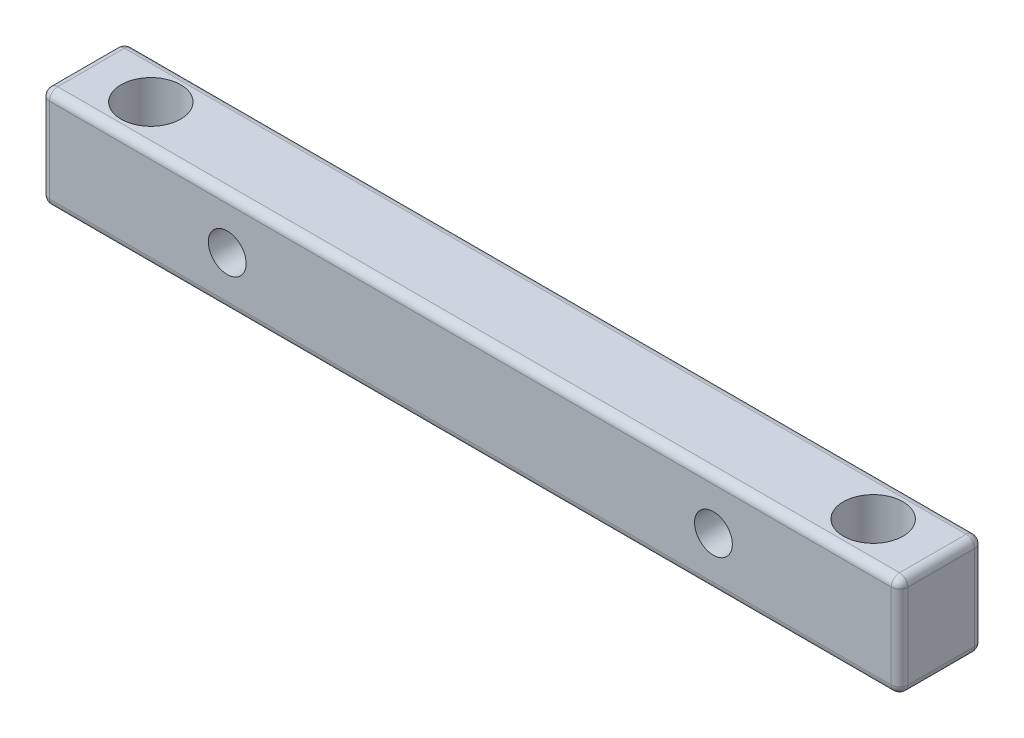
ISO-10303-21;
HEADER;
FILE_DESCRIPTION(('STEP AP214'),'2;1');
FILE_NAME('part.step','',(''),(''),'','','');
FILE_SCHEMA(('AUTOMOTIVE_DESIGN { 1 0 10303 214 1 1 1 1 }'));
ENDSEC;
DATA;
#1=APPLICATION_CONTEXT('core data for automotive mechanical design processes');
#2=APPLICATION_PROTOCOL_DEFINITION('international standard','automotive_design',2000,#1);
#3=PRODUCT_CONTEXT('',#1,'mechanical');
#4=PRODUCT('Part','Part','',(#3));
#5=PRODUCT_RELATED_PRODUCT_CATEGORY('part','',(#4));
#6=PRODUCT_DEFINITION_FORMATION('','',#4);
#7=PRODUCT_DEFINITION_CONTEXT('part definition',#1,'design');
#8=PRODUCT_DEFINITION('design','',#6,#7);
#9=PRODUCT_DEFINITION_SHAPE('','',#8);
#10=(LENGTH_UNIT() NAMED_UNIT(*) SI_UNIT(.MILLI.,.METRE.));
#11=(NAMED_UNIT(*) PLANE_ANGLE_UNIT() SI_UNIT($,.RADIAN.));
#12=(NAMED_UNIT(*) SI_UNIT($,.STERADIAN.) SOLID_ANGLE_UNIT());
#13=UNCERTAINTY_MEASURE_WITH_UNIT(LENGTH_MEASURE(1.E-05),#10,'distance_accuracy_value','');
#14=(GEOMETRIC_REPRESENTATION_CONTEXT(3) GLOBAL_UNCERTAINTY_ASSIGNED_CONTEXT((#13)) GLOBAL_UNIT_ASSIGNED_CONTEXT((#10,
#11,#12)) REPRESENTATION_CONTEXT('',''));
#15=CARTESIAN_POINT('',(0.,0.,0.));
#16=DIRECTION('',(0.,0.,1.));
#17=DIRECTION('',(1.,0.,0.));
#18=AXIS2_PLACEMENT_3D('',#15,#16,#17);
#19=CARTESIAN_POINT('',(0.,9.271,0.));
#20=DIRECTION('',(0.,1.,0.));
#21=DIRECTION('',(0.,0.,1.));
#22=AXIS2_PLACEMENT_3D('',#19,#20,#21);
#23=PLANE('',#22);
#24=DIRECTION('',(1.,0.,0.));
#25=VECTOR('',#24,1.);
#26=CARTESIAN_POINT('',(78.486,9.271,-0.761999999999995));
#27=LINE('',#26,#25);
#28=CARTESIAN_POINT('',(0.762,9.271,-0.762));
#29=VERTEX_POINT('',#28);
#30=CARTESIAN_POINT('',(77.724,9.271,-0.761999999999995));
#31=VERTEX_POINT('',#30);
#32=EDGE_CURVE('E201',#29,#31,#27,.T.);
#33=ORIENTED_EDGE('',*,*,#32,.T.);
#34=DIRECTION('',(0.,0.,-1.));
#35=VECTOR('',#34,1.);
#36=CARTESIAN_POINT('',(77.724,9.271,-7.62));
#37=LINE('',#36,#35);
#38=CARTESIAN_POINT('',(77.724,9.271,-6.858));
#39=VERTEX_POINT('',#38);
#40=EDGE_CURVE('E11',#31,#39,#37,.T.);
#41=ORIENTED_EDGE('',*,*,#40,.T.);
#42=DIRECTION('',(-1.,0.,0.));
#43=VECTOR('',#42,1.);
#44=CARTESIAN_POINT('',(0.,9.271,-6.858));
#45=LINE('',#44,#43);
#46=CARTESIAN_POINT('',(0.762,9.271,-6.858));
#47=VERTEX_POINT('',#46);
#48=EDGE_CURVE('E41',#39,#47,#45,.T.);
#49=ORIENTED_EDGE('',*,*,#48,.T.);
#50=DIRECTION('',(0.,0.,1.));
#51=VECTOR('',#50,1.);
#52=CARTESIAN_POINT('',(0.762,9.271,0.));
#53=LINE('',#52,#51);
#54=EDGE_CURVE('E203',#47,#29,#53,.T.);
#55=ORIENTED_EDGE('',*,*,#54,.T.);
#56=EDGE_LOOP('',(#33,#41,#49,#55));
#57=FACE_BOUND('',#56,.T.);
#58=CARTESIAN_POINT('',(6.223,9.271,-3.81));
#59=DIRECTION('',(0.,1.,0.));
#60=DIRECTION('',(0.,0.,1.));
#61=AXIS2_PLACEMENT_3D('',#58,#59,#60);
#62=CIRCLE('',#61,2.7305);
#63=CARTESIAN_POINT('',(6.223,9.271,-1.0795));
#64=VERTEX_POINT('',#63);
#65=EDGE_CURVE('E158',#64,#64,#62,.T.);
#66=ORIENTED_EDGE('',*,*,#65,.F.);
#67=EDGE_LOOP('',(#66));
#68=FACE_BOUND('',#67,.T.);
#69=CARTESIAN_POINT('',(72.263,9.271,-3.81));
#70=DIRECTION('',(0.,1.,0.));
#71=DIRECTION('',(0.,0.,1.));
#72=AXIS2_PLACEMENT_3D('',#69,#70,#71);
#73=CIRCLE('',#72,2.7305);
#74=CARTESIAN_POINT('',(72.263,9.271,-1.0795));
#75=VERTEX_POINT('',#74);
#76=EDGE_CURVE('E275',#75,#75,#73,.T.);
#77=ORIENTED_EDGE('',*,*,#76,.F.);
#78=EDGE_LOOP('',(#77));
#79=FACE_BOUND('',#78,.T.);
#80=ADVANCED_FACE('F32',(#57,#68,#79),#23,.T.);
#81=CARTESIAN_POINT('',(0.,0.,0.));
#82=DIRECTION('',(0.,1.,0.));
#83=DIRECTION('',(0.,0.,1.));
#84=AXIS2_PLACEMENT_3D('',#81,#82,#83);
#85=PLANE('',#84);
#86=DIRECTION('',(1.,0.,0.));
#87=VECTOR('',#86,1.);
#88=CARTESIAN_POINT('',(0.,0.,-0.762));
#89=LINE('',#88,#87);
#90=CARTESIAN_POINT('',(77.724,0.,-0.761999999999995));
#91=VERTEX_POINT('',#90);
#92=CARTESIAN_POINT('',(0.762,0.,-0.762));
#93=VERTEX_POINT('',#92);
#94=EDGE_CURVE('E185',#91,#93,#89,.F.);
#95=ORIENTED_EDGE('',*,*,#94,.T.);
#96=DIRECTION('',(0.,0.,1.));
#97=VECTOR('',#96,1.);
#98=CARTESIAN_POINT('',(0.762,0.,0.));
#99=LINE('',#98,#97);
#100=CARTESIAN_POINT('',(0.762,0.,-6.858));
#101=VERTEX_POINT('',#100);
#102=EDGE_CURVE('E189',#93,#101,#99,.F.);
#103=ORIENTED_EDGE('',*,*,#102,.T.);
#104=DIRECTION('',(-1.,0.,0.));
#105=VECTOR('',#104,1.);
#106=CARTESIAN_POINT('',(0.,0.,-6.858));
#107=LINE('',#106,#105);
#108=CARTESIAN_POINT('',(77.724,0.,-6.858));
#109=VERTEX_POINT('',#108);
#110=EDGE_CURVE('E187',#101,#109,#107,.F.);
#111=ORIENTED_EDGE('',*,*,#110,.T.);
#112=DIRECTION('',(0.,0.,-1.));
#113=VECTOR('',#112,1.);
#114=CARTESIAN_POINT('',(77.724,0.,-1.41553435639707E-13));
#115=LINE('',#114,#113);
#116=EDGE_CURVE('E183',#109,#91,#115,.F.);
#117=ORIENTED_EDGE('',*,*,#116,.T.);
#118=EDGE_LOOP('',(#95,#103,#111,#117));
#119=FACE_BOUND('',#118,.T.);
#120=CARTESIAN_POINT('',(6.223,0.,-3.81));
#121=DIRECTION('',(0.,1.,0.));
#122=DIRECTION('',(0.,0.,1.));
#123=AXIS2_PLACEMENT_3D('',#120,#121,#122);
#124=CIRCLE('',#123,2.7305);
#125=CARTESIAN_POINT('',(6.223,0.,-1.0795));
#126=VERTEX_POINT('',#125);
#127=EDGE_CURVE('E161',#126,#126,#124,.T.);
#128=ORIENTED_EDGE('',*,*,#127,.T.);
#129=EDGE_LOOP('',(#128));
#130=FACE_BOUND('',#129,.T.);
#131=CARTESIAN_POINT('',(72.263,0.,-3.81));
#132=DIRECTION('',(0.,1.,0.));
#133=DIRECTION('',(0.,0.,1.));
#134=AXIS2_PLACEMENT_3D('',#131,#132,#133);
#135=CIRCLE('',#134,2.7305);
#136=CARTESIAN_POINT('',(72.263,0.,-1.0795));
#137=VERTEX_POINT('',#136);
#138=EDGE_CURVE('E278',#137,#137,#135,.T.);
#139=ORIENTED_EDGE('',*,*,#138,.T.);
#140=EDGE_LOOP('',(#139));
#141=FACE_BOUND('',#140,.T.);
#142=ADVANCED_FACE('F303',(#119,#130,#141),#85,.F.);
#143=CARTESIAN_POINT('',(0.,9.271,-7.62));
#144=DIRECTION('',(1.,0.,0.));
#145=DIRECTION('',(0.,0.,-1.));
#146=AXIS2_PLACEMENT_3D('',#143,#144,#145);
#147=PLANE('',#146);
#148=DIRECTION('',(0.,-1.,0.));
#149=VECTOR('',#148,1.);
#150=CARTESIAN_POINT('',(0.,9.271,-6.858));
#151=LINE('',#150,#149);
#152=CARTESIAN_POINT('',(0.,8.509,-6.858));
#153=VERTEX_POINT('',#152);
#154=CARTESIAN_POINT('',(0.,0.762000000000001,-6.858));
#155=VERTEX_POINT('',#154);
#156=EDGE_CURVE('E132',#153,#155,#151,.T.);
#157=ORIENTED_EDGE('',*,*,#156,.T.);
#158=DIRECTION('',(0.,0.,1.));
#159=VECTOR('',#158,1.);
#160=CARTESIAN_POINT('',(0.,0.762000000000001,-7.62));
#161=LINE('',#160,#159);
#162=CARTESIAN_POINT('',(0.,0.762000000000001,-0.762));
#163=VERTEX_POINT('',#162);
#164=EDGE_CURVE('E128',#155,#163,#161,.T.);
#165=ORIENTED_EDGE('',*,*,#164,.T.);
#166=DIRECTION('',(0.,-1.,0.));
#167=VECTOR('',#166,1.);
#168=CARTESIAN_POINT('',(0.,9.271,-0.762));
#169=LINE('',#168,#167);
#170=CARTESIAN_POINT('',(0.,8.509,-0.762));
#171=VERTEX_POINT('',#170);
#172=EDGE_CURVE('E120',#163,#171,#169,.F.);
#173=ORIENTED_EDGE('',*,*,#172,.T.);
#174=DIRECTION('',(0.,0.,1.));
#175=VECTOR('',#174,1.);
#176=CARTESIAN_POINT('',(0.,8.509,-7.62));
#177=LINE('',#176,#175);
#178=EDGE_CURVE('E125',#171,#153,#177,.F.);
#179=ORIENTED_EDGE('',*,*,#178,.T.);
#180=EDGE_LOOP('',(#157,#165,#173,#179));
#181=FACE_BOUND('',#180,.T.);
#182=ADVANCED_FACE('F123',(#181),#147,.F.);
#183=CARTESIAN_POINT('',(0.,9.271,0.));
#184=DIRECTION('',(0.,0.,-1.));
#185=DIRECTION('',(-1.,0.,0.));
#186=AXIS2_PLACEMENT_3D('',#183,#184,#185);
#187=PLANE('',#186);
#188=DIRECTION('',(1.,0.,0.));
#189=VECTOR('',#188,1.);
#190=CARTESIAN_POINT('',(0.,8.509,0.));
#191=LINE('',#190,#189);
#192=CARTESIAN_POINT('',(77.724,8.509,0.));
#193=VERTEX_POINT('',#192);
#194=CARTESIAN_POINT('',(0.762,8.509,0.));
#195=VERTEX_POINT('',#194);
#196=EDGE_CURVE('E176',#193,#195,#191,.F.);
#197=ORIENTED_EDGE('',*,*,#196,.T.);
#198=DIRECTION('',(0.,-1.,0.));
#199=VECTOR('',#198,1.);
#200=CARTESIAN_POINT('',(0.762,9.271,0.));
#201=LINE('',#200,#199);
#202=CARTESIAN_POINT('',(0.762,0.762000000000001,0.));
#203=VERTEX_POINT('',#202);
#204=EDGE_CURVE('E140',#195,#203,#201,.T.);
#205=ORIENTED_EDGE('',*,*,#204,.T.);
#206=DIRECTION('',(1.,0.,0.));
#207=VECTOR('',#206,1.);
#208=CARTESIAN_POINT('',(0.,0.762000000000001,0.));
#209=LINE('',#208,#207);
#210=CARTESIAN_POINT('',(77.724,0.762000000000001,0.));
#211=VERTEX_POINT('',#210);
#212=EDGE_CURVE('E180',#203,#211,#209,.T.);
#213=ORIENTED_EDGE('',*,*,#212,.T.);
#214=DIRECTION('',(0.,-1.,0.));
#215=VECTOR('',#214,1.);
#216=CARTESIAN_POINT('',(77.724,9.271,0.));
#217=LINE('',#216,#215);
#218=EDGE_CURVE('E178',#211,#193,#217,.F.);
#219=ORIENTED_EDGE('',*,*,#218,.T.);
#220=EDGE_LOOP('',(#197,#205,#213,#219));
#221=FACE_BOUND('',#220,.T.);
#222=CARTESIAN_POINT('',(17.018,4.6355,0.));
#223=DIRECTION('',(0.,0.,1.));
#224=DIRECTION('',(1.,0.,0.));
#225=AXIS2_PLACEMENT_3D('',#222,#223,#224);
#226=CIRCLE('',#225,1.7272);
#227=CARTESIAN_POINT('',(18.7452,4.6355,0.));
#228=VERTEX_POINT('',#227);
#229=EDGE_CURVE('E269',#228,#228,#226,.T.);
#230=ORIENTED_EDGE('',*,*,#229,.F.);
#231=EDGE_LOOP('',(#230));
#232=FACE_BOUND('',#231,.T.);
#233=CARTESIAN_POINT('',(61.468,4.63550000000001,0.));
#234=DIRECTION('',(0.,0.,1.));
#235=DIRECTION('',(1.,0.,0.));
#236=AXIS2_PLACEMENT_3D('',#233,#234,#235);
#237=CIRCLE('',#236,1.7272);
#238=CARTESIAN_POINT('',(63.1952,4.63550000000001,0.));
#239=VERTEX_POINT('',#238);
#240=EDGE_CURVE('E258',#239,#239,#237,.T.);
#241=ORIENTED_EDGE('',*,*,#240,.F.);
#242=EDGE_LOOP('',(#241));
#243=FACE_BOUND('',#242,.T.);
#244=ADVANCED_FACE('F290',(#221,#232,#243),#187,.F.);
#245=CARTESIAN_POINT('',(78.486,9.271,-7.62));
#246=DIRECTION('',(-1.,0.,0.));
#247=DIRECTION('',(0.,0.,1.));
#248=AXIS2_PLACEMENT_3D('',#245,#246,#247);
#249=PLANE('',#248);
#250=DIRECTION('',(0.,-1.,0.));
#251=VECTOR('',#250,1.);
#252=CARTESIAN_POINT('',(78.486,9.271,-0.761999999999996));
#253=LINE('',#252,#251);
#254=CARTESIAN_POINT('',(78.486,8.509,-0.761999999999996));
#255=VERTEX_POINT('',#254);
#256=CARTESIAN_POINT('',(78.486,0.762000000000001,-0.761999999999996));
#257=VERTEX_POINT('',#256);
#258=EDGE_CURVE('E194',#255,#257,#253,.T.);
#259=ORIENTED_EDGE('',*,*,#258,.T.);
#260=DIRECTION('',(0.,0.,-1.));
#261=VECTOR('',#260,1.);
#262=CARTESIAN_POINT('',(78.486,0.762000000000001,-7.62));
#263=LINE('',#262,#261);
#264=CARTESIAN_POINT('',(78.486,0.762000000000001,-6.858));
#265=VERTEX_POINT('',#264);
#266=EDGE_CURVE('E198',#257,#265,#263,.T.);
#267=ORIENTED_EDGE('',*,*,#266,.T.);
#268=DIRECTION('',(0.,-1.,0.));
#269=VECTOR('',#268,1.);
#270=CARTESIAN_POINT('',(78.486,9.271,-6.858));
#271=LINE('',#270,#269);
#272=CARTESIAN_POINT('',(78.486,8.509,-6.858));
#273=VERTEX_POINT('',#272);
#274=EDGE_CURVE('E196',#265,#273,#271,.F.);
#275=ORIENTED_EDGE('',*,*,#274,.T.);
#276=DIRECTION('',(0.,0.,-1.));
#277=VECTOR('',#276,1.);
#278=CARTESIAN_POINT('',(78.486,8.509,0.));
#279=LINE('',#278,#277);
#280=EDGE_CURVE('E192',#273,#255,#279,.F.);
#281=ORIENTED_EDGE('',*,*,#280,.T.);
#282=EDGE_LOOP('',(#259,#267,#275,#281));
#283=FACE_BOUND('',#282,.T.);
#284=ADVANCED_FACE('F293',(#283),#249,.F.);
#285=CARTESIAN_POINT('',(0.,9.271,-7.62));
#286=DIRECTION('',(0.,0.,1.));
#287=DIRECTION('',(1.,0.,0.));
#288=AXIS2_PLACEMENT_3D('',#285,#286,#287);
#289=PLANE('',#288);
#290=DIRECTION('',(-1.,0.,0.));
#291=VECTOR('',#290,1.);
#292=CARTESIAN_POINT('',(0.,0.762000000000001,-7.62));
#293=LINE('',#292,#291);
#294=CARTESIAN_POINT('',(77.724,0.762000000000001,-7.62));
#295=VERTEX_POINT('',#294);
#296=CARTESIAN_POINT('',(0.762,0.762000000000001,-7.62));
#297=VERTEX_POINT('',#296);
#298=EDGE_CURVE('E171',#295,#297,#293,.T.);
#299=ORIENTED_EDGE('',*,*,#298,.T.);
#300=DIRECTION('',(0.,-1.,0.));
#301=VECTOR('',#300,1.);
#302=CARTESIAN_POINT('',(0.762,9.271,-7.62));
#303=LINE('',#302,#301);
#304=CARTESIAN_POINT('',(0.762,8.509,-7.62));
#305=VERTEX_POINT('',#304);
#306=EDGE_CURVE('E173',#297,#305,#303,.F.);
#307=ORIENTED_EDGE('',*,*,#306,.T.);
#308=DIRECTION('',(-1.,0.,0.));
#309=VECTOR('',#308,1.);
#310=CARTESIAN_POINT('',(78.486,8.509,-7.62));
#311=LINE('',#310,#309);
#312=CARTESIAN_POINT('',(77.724,8.509,-7.62));
#313=VERTEX_POINT('',#312);
#314=EDGE_CURVE('E167',#305,#313,#311,.F.);
#315=ORIENTED_EDGE('',*,*,#314,.T.);
#316=DIRECTION('',(0.,-1.,0.));
#317=VECTOR('',#316,1.);
#318=CARTESIAN_POINT('',(77.724,9.271,-7.62));
#319=LINE('',#318,#317);
#320=EDGE_CURVE('E169',#313,#295,#319,.T.);
#321=ORIENTED_EDGE('',*,*,#320,.T.);
#322=EDGE_LOOP('',(#299,#307,#315,#321));
#323=FACE_BOUND('',#322,.T.);
#324=CARTESIAN_POINT('',(17.018,4.6355,-7.62));
#325=DIRECTION('',(0.,0.,1.));
#326=DIRECTION('',(1.,0.,0.));
#327=AXIS2_PLACEMENT_3D('',#324,#325,#326);
#328=CIRCLE('',#327,1.7272);
#329=CARTESIAN_POINT('',(18.7452,4.6355,-7.62));
#330=VERTEX_POINT('',#329);
#331=EDGE_CURVE('E272',#330,#330,#328,.F.);
#332=ORIENTED_EDGE('',*,*,#331,.F.);
#333=EDGE_LOOP('',(#332));
#334=FACE_BOUND('',#333,.T.);
#335=CARTESIAN_POINT('',(61.468,4.63550000000001,-7.62));
#336=DIRECTION('',(0.,0.,1.));
#337=DIRECTION('',(1.,0.,0.));
#338=AXIS2_PLACEMENT_3D('',#335,#336,#337);
#339=CIRCLE('',#338,1.7272);
#340=CARTESIAN_POINT('',(63.1952,4.63550000000001,-7.62));
#341=VERTEX_POINT('',#340);
#342=EDGE_CURVE('E264',#341,#341,#339,.F.);
#343=ORIENTED_EDGE('',*,*,#342,.F.);
#344=EDGE_LOOP('',(#343));
#345=FACE_BOUND('',#344,.T.);
#346=ADVANCED_FACE('F300',(#323,#334,#345),#289,.F.);
#347=CARTESIAN_POINT('',(6.223,9.271,-3.81));
#348=DIRECTION('',(0.,-1.,0.));
#349=DIRECTION('',(0.,0.,-1.));
#350=AXIS2_PLACEMENT_3D('',#347,#348,#349);
#351=CYLINDRICAL_SURFACE('',#350,2.7305);
#352=ORIENTED_EDGE('',*,*,#65,.T.);
#353=EDGE_LOOP('',(#352));
#354=FACE_BOUND('',#353,.T.);
#355=ORIENTED_EDGE('',*,*,#127,.F.);
#356=EDGE_LOOP('',(#355));
#357=FACE_BOUND('',#356,.T.);
#358=ADVANCED_FACE('F314',(#354,#357),#351,.F.);
#359=CARTESIAN_POINT('',(72.263,9.271,-3.81));
#360=DIRECTION('',(0.,-1.,0.));
#361=DIRECTION('',(0.,0.,-1.));
#362=AXIS2_PLACEMENT_3D('',#359,#360,#361);
#363=CYLINDRICAL_SURFACE('',#362,2.7305);
#364=ORIENTED_EDGE('',*,*,#76,.T.);
#365=EDGE_LOOP('',(#364));
#366=FACE_BOUND('',#365,.T.);
#367=ORIENTED_EDGE('',*,*,#138,.F.);
#368=EDGE_LOOP('',(#367));
#369=FACE_BOUND('',#368,.T.);
#370=ADVANCED_FACE('F322',(#366,#369),#363,.F.);
#371=CARTESIAN_POINT('',(61.468,4.63550000000001,-12.5052593298616));
#372=DIRECTION('',(0.,0.,1.));
#373=DIRECTION('',(1.,0.,0.));
#374=AXIS2_PLACEMENT_3D('',#371,#372,#373);
#375=CYLINDRICAL_SURFACE('',#374,1.7272);
#376=CARTESIAN_POINT('',(63.1952,4.63550000000001,-7.62));
#377=CARTESIAN_POINT('',(63.1952,4.63550000000001,-7.540625));
#378=CARTESIAN_POINT('',(63.1952,4.63550000000001,-7.46125));
#379=CARTESIAN_POINT('',(63.1952,4.63550000000001,-7.3025));
#380=CARTESIAN_POINT('',(63.1952,4.63550000000001,-7.223125));
#381=CARTESIAN_POINT('',(63.1952,4.63550000000001,-7.064375));
#382=CARTESIAN_POINT('',(63.1952,4.63550000000001,-6.985));
#383=CARTESIAN_POINT('',(63.1952,4.63550000000001,-6.82625));
#384=CARTESIAN_POINT('',(63.1952,4.63550000000001,-6.746875));
#385=CARTESIAN_POINT('',(63.1952,4.63550000000001,-6.588125));
#386=CARTESIAN_POINT('',(63.1952,4.63550000000001,-6.50875));
#387=CARTESIAN_POINT('',(63.1952,4.63550000000001,-6.35));
#388=CARTESIAN_POINT('',(63.1952,4.63550000000001,-6.270625));
#389=CARTESIAN_POINT('',(63.1952,4.63550000000001,-6.111875));
#390=CARTESIAN_POINT('',(63.1952,4.63550000000001,-6.0325));
#391=CARTESIAN_POINT('',(63.1952,4.63550000000001,-5.87375));
#392=CARTESIAN_POINT('',(63.1952,4.63550000000001,-5.794375));
#393=CARTESIAN_POINT('',(63.1952,4.63550000000001,-5.635625));
#394=CARTESIAN_POINT('',(63.1952,4.63550000000001,-5.55625));
#395=CARTESIAN_POINT('',(63.1952,4.63550000000001,-5.3975));
#396=CARTESIAN_POINT('',(63.1952,4.63550000000001,-5.318125));
#397=CARTESIAN_POINT('',(63.1952,4.63550000000001,-5.159375));
#398=CARTESIAN_POINT('',(63.1952,4.63550000000001,-5.08));
#399=CARTESIAN_POINT('',(63.1952,4.63550000000001,-4.92125));
#400=CARTESIAN_POINT('',(63.1952,4.63550000000001,-4.841875));
#401=CARTESIAN_POINT('',(63.1952,4.63550000000001,-4.683125));
#402=CARTESIAN_POINT('',(63.1952,4.63550000000001,-4.60375));
#403=CARTESIAN_POINT('',(63.1952,4.63550000000001,-4.445));
#404=CARTESIAN_POINT('',(63.1952,4.63550000000001,-4.365625));
#405=CARTESIAN_POINT('',(63.1952,4.63550000000001,-4.206875));
#406=CARTESIAN_POINT('',(63.1952,4.63550000000001,-4.1275));
#407=CARTESIAN_POINT('',(63.1952,4.63550000000001,-3.96875));
#408=CARTESIAN_POINT('',(63.1952,4.63550000000001,-3.889375));
#409=CARTESIAN_POINT('',(63.1952,4.63550000000001,-3.730625));
#410=CARTESIAN_POINT('',(63.1952,4.63550000000001,-3.65125));
#411=CARTESIAN_POINT('',(63.1952,4.63550000000001,-3.4925));
#412=CARTESIAN_POINT('',(63.1952,4.63550000000001,-3.413125));
#413=CARTESIAN_POINT('',(63.1952,4.63550000000001,-3.254375));
#414=CARTESIAN_POINT('',(63.1952,4.63550000000001,-3.175));
#415=CARTESIAN_POINT('',(63.1952,4.63550000000001,-3.01625));
#416=CARTESIAN_POINT('',(63.1952,4.63550000000001,-2.936875));
#417=CARTESIAN_POINT('',(63.1952,4.63550000000001,-2.778125));
#418=CARTESIAN_POINT('',(63.1952,4.63550000000001,-2.69875));
#419=CARTESIAN_POINT('',(63.1952,4.63550000000001,-2.54));
#420=CARTESIAN_POINT('',(63.1952,4.63550000000001,-2.460625));
#421=CARTESIAN_POINT('',(63.1952,4.63550000000001,-2.301875));
#422=CARTESIAN_POINT('',(63.1952,4.63550000000001,-2.2225));
#423=CARTESIAN_POINT('',(63.1952,4.63550000000001,-2.06375));
#424=CARTESIAN_POINT('',(63.1952,4.63550000000001,-1.984375));
#425=CARTESIAN_POINT('',(63.1952,4.63550000000001,-1.825625));
#426=CARTESIAN_POINT('',(63.1952,4.63550000000001,-1.74625));
#427=CARTESIAN_POINT('',(63.1952,4.63550000000001,-1.5875));
#428=CARTESIAN_POINT('',(63.1952,4.63550000000001,-1.508125));
#429=CARTESIAN_POINT('',(63.1952,4.63550000000001,-1.349375));
#430=CARTESIAN_POINT('',(63.1952,4.63550000000001,-1.27));
#431=CARTESIAN_POINT('',(63.1952,4.63550000000001,-1.11125));
#432=CARTESIAN_POINT('',(63.1952,4.63550000000001,-1.031875));
#433=CARTESIAN_POINT('',(63.1952,4.63550000000001,-0.873125000000002));
#434=CARTESIAN_POINT('',(63.1952,4.63550000000001,-0.793750000000002));
#435=CARTESIAN_POINT('',(63.1952,4.63550000000001,-0.635000000000002));
#436=CARTESIAN_POINT('',(63.1952,4.63550000000001,-0.555625000000002));
#437=CARTESIAN_POINT('',(63.1952,4.63550000000001,-0.396875000000002));
#438=CARTESIAN_POINT('',(63.1952,4.63550000000001,-0.317500000000001));
#439=CARTESIAN_POINT('',(63.1952,4.63550000000001,-0.158750000000001));
#440=CARTESIAN_POINT('',(63.1952,4.63550000000001,-0.0793750000000013));
#441=CARTESIAN_POINT('',(63.1952,4.63550000000001,0.));
#442=B_SPLINE_CURVE_WITH_KNOTS('',3,(#376,#377,#378,#379,#380,#381,#382,#383,#384,#385,#386,
#387,#388,#389,#390,#391,#392,#393,#394,#395,#396,#397,#398,#399,#400,#401,#402,#403,#404,#405,
#406,#407,#408,#409,#410,#411,#412,#413,#414,#415,#416,#417,#418,#419,#420,#421,#422,#423,#424,
#425,#426,#427,#428,#429,#430,#431,#432,#433,#434,#435,#436,#437,#438,#439,#440,#441),
.UNSPECIFIED.,.F.,.F.,(4,2,2,2,2,2,2,2,2,2,2,2,2,2,2,2,2,2,2,2,2,2,2,2,2,2,2,2,2,2,2,2,4),(0.,
0.238125,0.47625,0.714375,0.9525,1.190625,1.42875,1.666875,1.905,2.143125,2.38125,2.619375,
2.8575,3.095625,3.33375,3.571875,3.81,4.048125,4.28625,4.524375,4.7625,5.000625,5.23875,
5.476875,5.715,5.953125,6.19125,6.429375,6.6675,6.905625,7.14375,7.381875,7.62),.UNSPECIFIED.);
#443=EDGE_CURVE('BSEAM330',#341,#239,#442,.T.);
#444=ORIENTED_EDGE('',*,*,#342,.T.);
#445=ORIENTED_EDGE('',*,*,#240,.T.);
#446=ORIENTED_EDGE('',*,*,#443,.T.);
#447=ORIENTED_EDGE('',*,*,#443,.F.);
#448=EDGE_LOOP('',(#444,#446,#445,#447));
#449=FACE_BOUND('',#448,.T.);
#450=ADVANCED_FACE('F330',(#449),#375,.F.);
#451=CARTESIAN_POINT('',(17.018,4.6355,-12.5052593298616));
#452=DIRECTION('',(0.,0.,1.));
#453=DIRECTION('',(1.,0.,0.));
#454=AXIS2_PLACEMENT_3D('',#451,#452,#453);
#455=CYLINDRICAL_SURFACE('',#454,1.7272);
#456=CARTESIAN_POINT('',(18.7452,4.6355,-7.62));
#457=CARTESIAN_POINT('',(18.7452,4.6355,-7.540625));
#458=CARTESIAN_POINT('',(18.7452,4.6355,-7.46125));
#459=CARTESIAN_POINT('',(18.7452,4.6355,-7.3025));
#460=CARTESIAN_POINT('',(18.7452,4.6355,-7.223125));
#461=CARTESIAN_POINT('',(18.7452,4.6355,-7.064375));
#462=CARTESIAN_POINT('',(18.7452,4.6355,-6.985));
#463=CARTESIAN_POINT('',(18.7452,4.6355,-6.82625));
#464=CARTESIAN_POINT('',(18.7452,4.6355,-6.746875));
#465=CARTESIAN_POINT('',(18.7452,4.6355,-6.588125));
#466=CARTESIAN_POINT('',(18.7452,4.6355,-6.50875));
#467=CARTESIAN_POINT('',(18.7452,4.6355,-6.35));
#468=CARTESIAN_POINT('',(18.7452,4.6355,-6.270625));
#469=CARTESIAN_POINT('',(18.7452,4.6355,-6.111875));
#470=CARTESIAN_POINT('',(18.7452,4.6355,-6.0325));
#471=CARTESIAN_POINT('',(18.7452,4.6355,-5.87375));
#472=CARTESIAN_POINT('',(18.7452,4.6355,-5.794375));
#473=CARTESIAN_POINT('',(18.7452,4.6355,-5.635625));
#474=CARTESIAN_POINT('',(18.7452,4.6355,-5.55625));
#475=CARTESIAN_POINT('',(18.7452,4.6355,-5.3975));
#476=CARTESIAN_POINT('',(18.7452,4.6355,-5.318125));
#477=CARTESIAN_POINT('',(18.7452,4.6355,-5.159375));
#478=CARTESIAN_POINT('',(18.7452,4.6355,-5.08));
#479=CARTESIAN_POINT('',(18.7452,4.6355,-4.92125));
#480=CARTESIAN_POINT('',(18.7452,4.6355,-4.841875));
#481=CARTESIAN_POINT('',(18.7452,4.6355,-4.683125));
#482=CARTESIAN_POINT('',(18.7452,4.6355,-4.60375));
#483=CARTESIAN_POINT('',(18.7452,4.6355,-4.445));
#484=CARTESIAN_POINT('',(18.7452,4.6355,-4.365625));
#485=CARTESIAN_POINT('',(18.7452,4.6355,-4.206875));
#486=CARTESIAN_POINT('',(18.7452,4.6355,-4.1275));
#487=CARTESIAN_POINT('',(18.7452,4.6355,-3.96875));
#488=CARTESIAN_POINT('',(18.7452,4.6355,-3.889375));
#489=CARTESIAN_POINT('',(18.7452,4.6355,-3.730625));
#490=CARTESIAN_POINT('',(18.7452,4.6355,-3.65125));
#491=CARTESIAN_POINT('',(18.7452,4.6355,-3.4925));
#492=CARTESIAN_POINT('',(18.7452,4.6355,-3.413125));
#493=CARTESIAN_POINT('',(18.7452,4.6355,-3.254375));
#494=CARTESIAN_POINT('',(18.7452,4.6355,-3.175));
#495=CARTESIAN_POINT('',(18.7452,4.6355,-3.01625));
#496=CARTESIAN_POINT('',(18.7452,4.6355,-2.936875));
#497=CARTESIAN_POINT('',(18.7452,4.6355,-2.778125));
#498=CARTESIAN_POINT('',(18.7452,4.6355,-2.69875));
#499=CARTESIAN_POINT('',(18.7452,4.6355,-2.54));
#500=CARTESIAN_POINT('',(18.7452,4.6355,-2.460625));
#501=CARTESIAN_POINT('',(18.7452,4.6355,-2.301875));
#502=CARTESIAN_POINT('',(18.7452,4.6355,-2.2225));
#503=CARTESIAN_POINT('',(18.7452,4.6355,-2.06375));
#504=CARTESIAN_POINT('',(18.7452,4.6355,-1.984375));
#505=CARTESIAN_POINT('',(18.7452,4.6355,-1.825625));
#506=CARTESIAN_POINT('',(18.7452,4.6355,-1.74625));
#507=CARTESIAN_POINT('',(18.7452,4.6355,-1.5875));
#508=CARTESIAN_POINT('',(18.7452,4.6355,-1.508125));
#509=CARTESIAN_POINT('',(18.7452,4.6355,-1.349375));
#510=CARTESIAN_POINT('',(18.7452,4.6355,-1.27));
#511=CARTESIAN_POINT('',(18.7452,4.6355,-1.11125));
#512=CARTESIAN_POINT('',(18.7452,4.6355,-1.031875));
#513=CARTESIAN_POINT('',(18.7452,4.6355,-0.873125000000002));
#514=CARTESIAN_POINT('',(18.7452,4.6355,-0.793750000000002));
#515=CARTESIAN_POINT('',(18.7452,4.6355,-0.635000000000002));
#516=CARTESIAN_POINT('',(18.7452,4.6355,-0.555625000000002));
#517=CARTESIAN_POINT('',(18.7452,4.6355,-0.396875000000002));
#518=CARTESIAN_POINT('',(18.7452,4.6355,-0.317500000000001));
#519=CARTESIAN_POINT('',(18.7452,4.6355,-0.158750000000001));
#520=CARTESIAN_POINT('',(18.7452,4.6355,-0.0793750000000013));
#521=CARTESIAN_POINT('',(18.7452,4.6355,0.));
#522=B_SPLINE_CURVE_WITH_KNOTS('',3,(#456,#457,#458,#459,#460,#461,#462,#463,#464,#465,#466,
#467,#468,#469,#470,#471,#472,#473,#474,#475,#476,#477,#478,#479,#480,#481,#482,#483,#484,#485,
#486,#487,#488,#489,#490,#491,#492,#493,#494,#495,#496,#497,#498,#499,#500,#501,#502,#503,#504,
#505,#506,#507,#508,#509,#510,#511,#512,#513,#514,#515,#516,#517,#518,#519,#520,#521),
.UNSPECIFIED.,.F.,.F.,(4,2,2,2,2,2,2,2,2,2,2,2,2,2,2,2,2,2,2,2,2,2,2,2,2,2,2,2,2,2,2,2,4),(0.,
0.238125,0.47625,0.714375,0.9525,1.190625,1.42875,1.666875,1.905,2.143125,2.38125,2.619375,
2.8575,3.095625,3.33375,3.571875,3.81,4.048125,4.28625,4.524375,4.7625,5.000625,5.23875,
5.476875,5.715,5.953125,6.19125,6.429375,6.6675,6.905625,7.14375,7.381875,7.62),.UNSPECIFIED.);
#523=EDGE_CURVE('BSEAM288',#330,#228,#522,.T.);
#524=ORIENTED_EDGE('',*,*,#331,.T.);
#525=ORIENTED_EDGE('',*,*,#229,.T.);
#526=ORIENTED_EDGE('',*,*,#523,.T.);
#527=ORIENTED_EDGE('',*,*,#523,.F.);
#528=EDGE_LOOP('',(#524,#526,#525,#527));
#529=FACE_BOUND('',#528,.T.);
#530=ADVANCED_FACE('F288',(#529),#455,.F.);
#531=CARTESIAN_POINT('',(77.724,9.271,-0.761999999999994));
#532=DIRECTION('',(0.,-1.,0.));
#533=DIRECTION('',(0.,0.,-1.));
#534=AXIS2_PLACEMENT_3D('',#531,#532,#533);
#535=CYLINDRICAL_SURFACE('',#534,0.762);
#536=CARTESIAN_POINT('',(77.724,8.509,-0.761999999999995));
#537=DIRECTION('',(0.,1.,0.));
#538=DIRECTION('',(0.,0.,1.));
#539=AXIS2_PLACEMENT_3D('',#536,#537,#538);
#540=CIRCLE('',#539,0.762);
#541=EDGE_CURVE('E36',#193,#255,#540,.T.);
#542=ORIENTED_EDGE('',*,*,#541,.F.);
#543=ORIENTED_EDGE('',*,*,#218,.F.);
#544=CARTESIAN_POINT('',(77.724,0.762000000000001,-0.761999999999994));
#545=DIRECTION('',(0.,-1.,0.));
#546=DIRECTION('',(0.,0.,-1.));
#547=AXIS2_PLACEMENT_3D('',#544,#545,#546);
#548=CIRCLE('',#547,0.762);
#549=EDGE_CURVE('E251',#257,#211,#548,.T.);
#550=ORIENTED_EDGE('',*,*,#549,.F.);
#551=ORIENTED_EDGE('',*,*,#258,.F.);
#552=EDGE_LOOP('',(#542,#543,#550,#551));
#553=FACE_BOUND('',#552,.T.);
#554=ADVANCED_FACE('F34',(#553),#535,.T.);
#555=CARTESIAN_POINT('',(77.724,8.509,-0.761999999999995));
#556=DIRECTION('',(0.,0.,1.));
#557=DIRECTION('',(1.,0.,0.));
#558=AXIS2_PLACEMENT_3D('',#555,#556,#557);
#559=SPHERICAL_SURFACE('',#558,0.762);
#560=CARTESIAN_POINT('',(77.724,8.509,-0.761999999999995));
#561=DIRECTION('',(1.,0.,0.));
#562=DIRECTION('',(0.,0.,-1.));
#563=AXIS2_PLACEMENT_3D('',#560,#561,#562);
#564=CIRCLE('',#563,0.762);
#565=EDGE_CURVE('E246',#193,#31,#564,.F.);
#566=ORIENTED_EDGE('',*,*,#565,.F.);
#567=ORIENTED_EDGE('',*,*,#541,.T.);
#568=CARTESIAN_POINT('',(77.724,8.509,-0.761999999999994));
#569=DIRECTION('',(0.,0.,1.));
#570=DIRECTION('',(1.,0.,0.));
#571=AXIS2_PLACEMENT_3D('',#568,#569,#570);
#572=CIRCLE('',#571,0.762);
#573=EDGE_CURVE('E249',#31,#255,#572,.F.);
#574=ORIENTED_EDGE('',*,*,#573,.F.);
#575=EDGE_LOOP('',(#566,#567,#574));
#576=FACE_BOUND('',#575,.T.);
#577=ADVANCED_FACE('F373',(#576),#559,.T.);
#578=CARTESIAN_POINT('',(77.724,0.762,-0.761999999999995));
#579=DIRECTION('',(0.,0.,1.));
#580=DIRECTION('',(1.,0.,0.));
#581=AXIS2_PLACEMENT_3D('',#578,#579,#580);
#582=SPHERICAL_SURFACE('',#581,0.762);
#583=CARTESIAN_POINT('',(77.724,0.762,-0.761999999999995));
#584=DIRECTION('',(0.,0.,1.));
#585=DIRECTION('',(1.,0.,0.));
#586=AXIS2_PLACEMENT_3D('',#583,#584,#585);
#587=CIRCLE('',#586,0.762);
#588=EDGE_CURVE('E240',#257,#91,#587,.F.);
#589=ORIENTED_EDGE('',*,*,#588,.F.);
#590=ORIENTED_EDGE('',*,*,#549,.T.);
#591=CARTESIAN_POINT('',(77.724,0.762000000000001,-0.761999999999995));
#592=DIRECTION('',(1.,0.,0.));
#593=DIRECTION('',(0.,0.,-1.));
#594=AXIS2_PLACEMENT_3D('',#591,#592,#593);
#595=CIRCLE('',#594,0.762);
#596=EDGE_CURVE('E243',#91,#211,#595,.F.);
#597=ORIENTED_EDGE('',*,*,#596,.F.);
#598=EDGE_LOOP('',(#589,#590,#597));
#599=FACE_BOUND('',#598,.T.);
#600=ADVANCED_FACE('F381',(#599),#582,.T.);
#601=CARTESIAN_POINT('',(77.724,8.509,-1.41553435639707E-13));
#602=DIRECTION('',(0.,0.,1.));
#603=DIRECTION('',(1.,0.,0.));
#604=AXIS2_PLACEMENT_3D('',#601,#602,#603);
#605=CYLINDRICAL_SURFACE('',#604,0.762);
#606=ORIENTED_EDGE('',*,*,#573,.T.);
#607=ORIENTED_EDGE('',*,*,#280,.F.);
#608=CARTESIAN_POINT('',(77.724,8.509,-6.858));
#609=DIRECTION('',(0.,0.,-1.));
#610=DIRECTION('',(-1.,0.,0.));
#611=AXIS2_PLACEMENT_3D('',#608,#609,#610);
#612=CIRCLE('',#611,0.762);
#613=EDGE_CURVE('E234',#39,#273,#612,.T.);
#614=ORIENTED_EDGE('',*,*,#613,.F.);
#615=ORIENTED_EDGE('',*,*,#40,.F.);
#616=EDGE_LOOP('',(#606,#607,#614,#615));
#617=FACE_BOUND('',#616,.T.);
#618=ADVANCED_FACE('F388',(#617),#605,.T.);
#619=CARTESIAN_POINT('',(0.,8.509,-0.762));
#620=DIRECTION('',(-1.,0.,0.));
#621=DIRECTION('',(0.,0.,1.));
#622=AXIS2_PLACEMENT_3D('',#619,#620,#621);
#623=CYLINDRICAL_SURFACE('',#622,0.762);
#624=ORIENTED_EDGE('',*,*,#565,.T.);
#625=ORIENTED_EDGE('',*,*,#32,.F.);
#626=CARTESIAN_POINT('',(0.762,8.509,-0.762));
#627=DIRECTION('',(-1.,0.,0.));
#628=DIRECTION('',(0.,0.,1.));
#629=AXIS2_PLACEMENT_3D('',#626,#627,#628);
#630=CIRCLE('',#629,0.762);
#631=EDGE_CURVE('E144',#195,#29,#630,.T.);
#632=ORIENTED_EDGE('',*,*,#631,.F.);
#633=ORIENTED_EDGE('',*,*,#196,.F.);
#634=EDGE_LOOP('',(#624,#625,#632,#633));
#635=FACE_BOUND('',#634,.T.);
#636=ADVANCED_FACE('F396',(#635),#623,.T.);
#637=CARTESIAN_POINT('',(0.762,9.271,-0.762));
#638=DIRECTION('',(0.,-1.,0.));
#639=DIRECTION('',(0.,0.,-1.));
#640=AXIS2_PLACEMENT_3D('',#637,#638,#639);
#641=CYLINDRICAL_SURFACE('',#640,0.762);
#642=CARTESIAN_POINT('',(0.762,0.762000000000001,-0.762));
#643=DIRECTION('',(0.,-1.,0.));
#644=DIRECTION('',(0.,0.,-1.));
#645=AXIS2_PLACEMENT_3D('',#642,#643,#644);
#646=CIRCLE('',#645,0.762);
#647=EDGE_CURVE('E145',#203,#163,#646,.T.);
#648=ORIENTED_EDGE('',*,*,#647,.F.);
#649=ORIENTED_EDGE('',*,*,#204,.F.);
#650=CARTESIAN_POINT('',(0.762,8.509,-0.762));
#651=DIRECTION('',(0.,1.,0.));
#652=DIRECTION('',(0.,0.,1.));
#653=AXIS2_PLACEMENT_3D('',#650,#651,#652);
#654=CIRCLE('',#653,0.762);
#655=EDGE_CURVE('E136',#171,#195,#654,.T.);
#656=ORIENTED_EDGE('',*,*,#655,.F.);
#657=ORIENTED_EDGE('',*,*,#172,.F.);
#658=EDGE_LOOP('',(#648,#649,#656,#657));
#659=FACE_BOUND('',#658,.T.);
#660=ADVANCED_FACE('F138',(#659),#641,.T.);
#661=CARTESIAN_POINT('',(0.,0.762000000000001,-0.762));
#662=DIRECTION('',(1.,0.,0.));
#663=DIRECTION('',(0.,0.,-1.));
#664=AXIS2_PLACEMENT_3D('',#661,#662,#663);
#665=CYLINDRICAL_SURFACE('',#664,0.762);
#666=ORIENTED_EDGE('',*,*,#596,.T.);
#667=ORIENTED_EDGE('',*,*,#212,.F.);
#668=CARTESIAN_POINT('',(0.762,0.762,-0.762));
#669=DIRECTION('',(-1.,0.,0.));
#670=DIRECTION('',(0.,0.,1.));
#671=AXIS2_PLACEMENT_3D('',#668,#669,#670);
#672=CIRCLE('',#671,0.762);
#673=EDGE_CURVE('E230',#93,#203,#672,.T.);
#674=ORIENTED_EDGE('',*,*,#673,.F.);
#675=ORIENTED_EDGE('',*,*,#94,.F.);
#676=EDGE_LOOP('',(#666,#667,#674,#675));
#677=FACE_BOUND('',#676,.T.);
#678=ADVANCED_FACE('F413',(#677),#665,.T.);
#679=CARTESIAN_POINT('',(77.724,0.762000000000001,-7.62));
#680=DIRECTION('',(0.,0.,-1.));
#681=DIRECTION('',(-1.,0.,0.));
#682=AXIS2_PLACEMENT_3D('',#679,#680,#681);
#683=CYLINDRICAL_SURFACE('',#682,0.762);
#684=ORIENTED_EDGE('',*,*,#588,.T.);
#685=ORIENTED_EDGE('',*,*,#116,.F.);
#686=CARTESIAN_POINT('',(77.724,0.762000000000001,-6.858));
#687=DIRECTION('',(0.,0.,-1.));
#688=DIRECTION('',(-1.,0.,0.));
#689=AXIS2_PLACEMENT_3D('',#686,#687,#688);
#690=CIRCLE('',#689,0.762);
#691=EDGE_CURVE('E227',#265,#109,#690,.T.);
#692=ORIENTED_EDGE('',*,*,#691,.F.);
#693=ORIENTED_EDGE('',*,*,#266,.F.);
#694=EDGE_LOOP('',(#684,#685,#692,#693));
#695=FACE_BOUND('',#694,.T.);
#696=ADVANCED_FACE('F421',(#695),#683,.T.);
#697=CARTESIAN_POINT('',(77.724,9.271,-6.858));
#698=DIRECTION('',(0.,-1.,0.));
#699=DIRECTION('',(0.,0.,-1.));
#700=AXIS2_PLACEMENT_3D('',#697,#698,#699);
#701=CYLINDRICAL_SURFACE('',#700,0.762);
#702=CARTESIAN_POINT('',(77.724,8.509,-6.858));
#703=DIRECTION('',(0.,1.,0.));
#704=DIRECTION('',(0.,0.,1.));
#705=AXIS2_PLACEMENT_3D('',#702,#703,#704);
#706=CIRCLE('',#705,0.762);
#707=EDGE_CURVE('E237',#273,#313,#706,.T.);
#708=ORIENTED_EDGE('',*,*,#707,.F.);
#709=ORIENTED_EDGE('',*,*,#274,.F.);
#710=CARTESIAN_POINT('',(77.724,0.762000000000001,-6.858));
#711=DIRECTION('',(0.,-1.,0.));
#712=DIRECTION('',(0.,0.,-1.));
#713=AXIS2_PLACEMENT_3D('',#710,#711,#712);
#714=CIRCLE('',#713,0.762);
#715=EDGE_CURVE('E225',#295,#265,#714,.T.);
#716=ORIENTED_EDGE('',*,*,#715,.F.);
#717=ORIENTED_EDGE('',*,*,#320,.F.);
#718=EDGE_LOOP('',(#708,#709,#716,#717));
#719=FACE_BOUND('',#718,.T.);
#720=ADVANCED_FACE('F430',(#719),#701,.T.);
#721=CARTESIAN_POINT('',(77.724,8.509,-6.858));
#722=DIRECTION('',(0.,0.,1.));
#723=DIRECTION('',(1.,0.,0.));
#724=AXIS2_PLACEMENT_3D('',#721,#722,#723);
#725=SPHERICAL_SURFACE('',#724,0.762);
#726=ORIENTED_EDGE('',*,*,#613,.T.);
#727=ORIENTED_EDGE('',*,*,#707,.T.);
#728=CARTESIAN_POINT('',(77.724,8.509,-6.858));
#729=DIRECTION('',(1.,0.,0.));
#730=DIRECTION('',(0.,0.,-1.));
#731=AXIS2_PLACEMENT_3D('',#728,#729,#730);
#732=CIRCLE('',#731,0.762);
#733=EDGE_CURVE('E151',#39,#313,#732,.F.);
#734=ORIENTED_EDGE('',*,*,#733,.F.);
#735=EDGE_LOOP('',(#726,#727,#734));
#736=FACE_BOUND('',#735,.T.);
#737=ADVANCED_FACE('F439',(#736),#725,.T.);
#738=CARTESIAN_POINT('',(0.762,8.509,-0.762));
#739=DIRECTION('',(0.,0.,1.));
#740=DIRECTION('',(1.,0.,0.));
#741=AXIS2_PLACEMENT_3D('',#738,#739,#740);
#742=SPHERICAL_SURFACE('',#741,0.762);
#743=ORIENTED_EDGE('',*,*,#655,.T.);
#744=ORIENTED_EDGE('',*,*,#631,.T.);
#745=CARTESIAN_POINT('',(0.762,8.509,-0.762));
#746=DIRECTION('',(0.,0.,1.));
#747=DIRECTION('',(1.,0.,0.));
#748=AXIS2_PLACEMENT_3D('',#745,#746,#747);
#749=CIRCLE('',#748,0.762);
#750=EDGE_CURVE('E148',#171,#29,#749,.F.);
#751=ORIENTED_EDGE('',*,*,#750,.F.);
#752=EDGE_LOOP('',(#743,#744,#751));
#753=FACE_BOUND('',#752,.T.);
#754=ADVANCED_FACE('F149',(#753),#742,.T.);
#755=CARTESIAN_POINT('',(0.762,0.762,-0.762));
#756=DIRECTION('',(0.,0.,1.));
#757=DIRECTION('',(1.,0.,0.));
#758=AXIS2_PLACEMENT_3D('',#755,#756,#757);
#759=SPHERICAL_SURFACE('',#758,0.762);
#760=ORIENTED_EDGE('',*,*,#673,.T.);
#761=ORIENTED_EDGE('',*,*,#647,.T.);
#762=CARTESIAN_POINT('',(0.762,0.762000000000001,-0.762));
#763=DIRECTION('',(0.,0.,1.));
#764=DIRECTION('',(1.,0.,0.));
#765=AXIS2_PLACEMENT_3D('',#762,#763,#764);
#766=CIRCLE('',#765,0.762);
#767=EDGE_CURVE('E152',#93,#163,#766,.F.);
#768=ORIENTED_EDGE('',*,*,#767,.F.);
#769=EDGE_LOOP('',(#760,#761,#768));
#770=FACE_BOUND('',#769,.T.);
#771=ADVANCED_FACE('F456',(#770),#759,.T.);
#772=CARTESIAN_POINT('',(77.724,0.762,-6.858));
#773=DIRECTION('',(0.,0.,1.));
#774=DIRECTION('',(1.,0.,0.));
#775=AXIS2_PLACEMENT_3D('',#772,#773,#774);
#776=SPHERICAL_SURFACE('',#775,0.762);
#777=ORIENTED_EDGE('',*,*,#715,.T.);
#778=ORIENTED_EDGE('',*,*,#691,.T.);
#779=CARTESIAN_POINT('',(77.724,0.762,-6.858));
#780=DIRECTION('',(1.,0.,0.));
#781=DIRECTION('',(0.,0.,-1.));
#782=AXIS2_PLACEMENT_3D('',#779,#780,#781);
#783=CIRCLE('',#782,0.762);
#784=EDGE_CURVE('E219',#295,#109,#783,.F.);
#785=ORIENTED_EDGE('',*,*,#784,.F.);
#786=EDGE_LOOP('',(#777,#778,#785));
#787=FACE_BOUND('',#786,.T.);
#788=ADVANCED_FACE('F464',(#787),#776,.T.);
#789=CARTESIAN_POINT('',(0.,8.509,-6.858));
#790=DIRECTION('',(1.,0.,0.));
#791=DIRECTION('',(0.,0.,-1.));
#792=AXIS2_PLACEMENT_3D('',#789,#790,#791);
#793=CYLINDRICAL_SURFACE('',#792,0.762);
#794=ORIENTED_EDGE('',*,*,#733,.T.);
#795=ORIENTED_EDGE('',*,*,#314,.F.);
#796=CARTESIAN_POINT('',(0.762,8.509,-6.858));
#797=DIRECTION('',(-1.,0.,0.));
#798=DIRECTION('',(0.,0.,1.));
#799=AXIS2_PLACEMENT_3D('',#796,#797,#798);
#800=CIRCLE('',#799,0.762);
#801=EDGE_CURVE('E216',#47,#305,#800,.T.);
#802=ORIENTED_EDGE('',*,*,#801,.F.);
#803=ORIENTED_EDGE('',*,*,#48,.F.);
#804=EDGE_LOOP('',(#794,#795,#802,#803));
#805=FACE_BOUND('',#804,.T.);
#806=ADVANCED_FACE('F473',(#805),#793,.T.);
#807=CARTESIAN_POINT('',(0.762,8.509,0.));
#808=DIRECTION('',(0.,0.,-1.));
#809=DIRECTION('',(-1.,0.,0.));
#810=AXIS2_PLACEMENT_3D('',#807,#808,#809);
#811=CYLINDRICAL_SURFACE('',#810,0.762);
#812=ORIENTED_EDGE('',*,*,#750,.T.);
#813=ORIENTED_EDGE('',*,*,#54,.F.);
#814=CARTESIAN_POINT('',(0.762,8.509,-6.858));
#815=DIRECTION('',(0.,0.,-1.));
#816=DIRECTION('',(-1.,0.,0.));
#817=AXIS2_PLACEMENT_3D('',#814,#815,#816);
#818=CIRCLE('',#817,0.762);
#819=EDGE_CURVE('E156',#153,#47,#818,.T.);
#820=ORIENTED_EDGE('',*,*,#819,.F.);
#821=ORIENTED_EDGE('',*,*,#178,.F.);
#822=EDGE_LOOP('',(#812,#813,#820,#821));
#823=FACE_BOUND('',#822,.T.);
#824=ADVANCED_FACE('F154',(#823),#811,.T.);
#825=CARTESIAN_POINT('',(0.762,0.762000000000001,-7.62));
#826=DIRECTION('',(0.,0.,1.));
#827=DIRECTION('',(1.,0.,0.));
#828=AXIS2_PLACEMENT_3D('',#825,#826,#827);
#829=CYLINDRICAL_SURFACE('',#828,0.762);
#830=ORIENTED_EDGE('',*,*,#767,.T.);
#831=ORIENTED_EDGE('',*,*,#164,.F.);
#832=CARTESIAN_POINT('',(0.762,0.762,-6.858));
#833=DIRECTION('',(0.,0.,-1.));
#834=DIRECTION('',(-1.,0.,0.));
#835=AXIS2_PLACEMENT_3D('',#832,#833,#834);
#836=CIRCLE('',#835,0.762);
#837=EDGE_CURVE('E212',#101,#155,#836,.T.);
#838=ORIENTED_EDGE('',*,*,#837,.F.);
#839=ORIENTED_EDGE('',*,*,#102,.F.);
#840=EDGE_LOOP('',(#830,#831,#838,#839));
#841=FACE_BOUND('',#840,.T.);
#842=ADVANCED_FACE('F489',(#841),#829,.T.);
#843=CARTESIAN_POINT('',(0.,0.762000000000001,-6.858));
#844=DIRECTION('',(-1.,0.,0.));
#845=DIRECTION('',(0.,0.,1.));
#846=AXIS2_PLACEMENT_3D('',#843,#844,#845);
#847=CYLINDRICAL_SURFACE('',#846,0.762);
#848=ORIENTED_EDGE('',*,*,#784,.T.);
#849=ORIENTED_EDGE('',*,*,#110,.F.);
#850=CARTESIAN_POINT('',(0.762,0.762000000000001,-6.858));
#851=DIRECTION('',(-1.,0.,0.));
#852=DIRECTION('',(0.,0.,1.));
#853=AXIS2_PLACEMENT_3D('',#850,#851,#852);
#854=CIRCLE('',#853,0.762);
#855=EDGE_CURVE('E210',#297,#101,#854,.T.);
#856=ORIENTED_EDGE('',*,*,#855,.F.);
#857=ORIENTED_EDGE('',*,*,#298,.F.);
#858=EDGE_LOOP('',(#848,#849,#856,#857));
#859=FACE_BOUND('',#858,.T.);
#860=ADVANCED_FACE('F497',(#859),#847,.T.);
#861=CARTESIAN_POINT('',(0.762,8.509,-6.858));
#862=DIRECTION('',(0.,0.,1.));
#863=DIRECTION('',(1.,0.,0.));
#864=AXIS2_PLACEMENT_3D('',#861,#862,#863);
#865=SPHERICAL_SURFACE('',#864,0.762);
#866=ORIENTED_EDGE('',*,*,#819,.T.);
#867=ORIENTED_EDGE('',*,*,#801,.T.);
#868=CARTESIAN_POINT('',(0.762,8.509,-6.858));
#869=DIRECTION('',(0.,1.,0.));
#870=DIRECTION('',(0.,0.,1.));
#871=AXIS2_PLACEMENT_3D('',#868,#869,#870);
#872=CIRCLE('',#871,0.762);
#873=EDGE_CURVE('E208',#153,#305,#872,.F.);
#874=ORIENTED_EDGE('',*,*,#873,.F.);
#875=EDGE_LOOP('',(#866,#867,#874));
#876=FACE_BOUND('',#875,.T.);
#877=ADVANCED_FACE('F506',(#876),#865,.T.);
#878=CARTESIAN_POINT('',(0.762,0.762,-6.858));
#879=DIRECTION('',(0.,0.,1.));
#880=DIRECTION('',(1.,0.,0.));
#881=AXIS2_PLACEMENT_3D('',#878,#879,#880);
#882=SPHERICAL_SURFACE('',#881,0.762);
#883=ORIENTED_EDGE('',*,*,#855,.T.);
#884=ORIENTED_EDGE('',*,*,#837,.T.);
#885=CARTESIAN_POINT('',(0.762,0.762000000000001,-6.858));
#886=DIRECTION('',(0.,-1.,0.));
#887=DIRECTION('',(0.,0.,-1.));
#888=AXIS2_PLACEMENT_3D('',#885,#886,#887);
#889=CIRCLE('',#888,0.762);
#890=EDGE_CURVE('E206',#297,#155,#889,.F.);
#891=ORIENTED_EDGE('',*,*,#890,.F.);
#892=EDGE_LOOP('',(#883,#884,#891));
#893=FACE_BOUND('',#892,.T.);
#894=ADVANCED_FACE('F515',(#893),#882,.T.);
#895=CARTESIAN_POINT('',(0.762,9.271,-6.858));
#896=DIRECTION('',(0.,-1.,0.));
#897=DIRECTION('',(0.,0.,-1.));
#898=AXIS2_PLACEMENT_3D('',#895,#896,#897);
#899=CYLINDRICAL_SURFACE('',#898,0.762);
#900=ORIENTED_EDGE('',*,*,#873,.T.);
#901=ORIENTED_EDGE('',*,*,#306,.F.);
#902=ORIENTED_EDGE('',*,*,#890,.T.);
#903=ORIENTED_EDGE('',*,*,#156,.F.);
#904=EDGE_LOOP('',(#900,#901,#902,#903));
#905=FACE_BOUND('',#904,.T.);
#906=ADVANCED_FACE('F524',(#905),#899,.T.);
#907=CLOSED_SHELL('',(#80,#142,#182,#244,#284,#346,#358,#370,#450,#530,#554,#577,#600,#618,#636,
#660,#678,#696,#720,#737,#754,#771,#788,#806,#824,#842,#860,#877,#894,#906));
#908=MANIFOLD_SOLID_BREP('B2',#907);
#909=ADVANCED_BREP_SHAPE_REPRESENTATION('',(#18,#908),#14);
#910=SHAPE_DEFINITION_REPRESENTATION(#9,#909);
ENDSEC;
END-ISO-10303-21;
